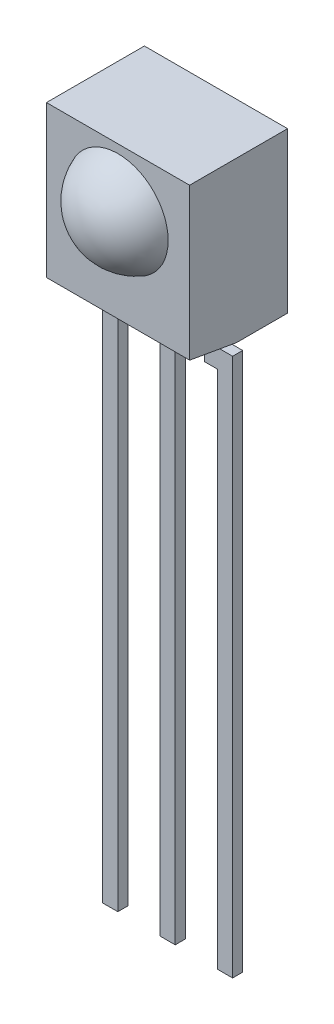
ISO-10303-21;
HEADER;
FILE_DESCRIPTION(('STEP AP214'),'2;1');
FILE_NAME('part.step','',(''),(''),'','','');
FILE_SCHEMA(('AUTOMOTIVE_DESIGN { 1 0 10303 214 1 1 1 1 }'));
ENDSEC;
DATA;
#1=APPLICATION_CONTEXT('core data for automotive mechanical design processes');
#2=APPLICATION_PROTOCOL_DEFINITION('international standard','automotive_design',2000,#1);
#3=PRODUCT_CONTEXT('',#1,'mechanical');
#4=PRODUCT('Part','Part','',(#3));
#5=PRODUCT_RELATED_PRODUCT_CATEGORY('part','',(#4));
#6=PRODUCT_DEFINITION_FORMATION('','',#4);
#7=PRODUCT_DEFINITION_CONTEXT('part definition',#1,'design');
#8=PRODUCT_DEFINITION('design','',#6,#7);
#9=PRODUCT_DEFINITION_SHAPE('','',#8);
#10=(LENGTH_UNIT() NAMED_UNIT(*) SI_UNIT(.MILLI.,.METRE.));
#11=(NAMED_UNIT(*) PLANE_ANGLE_UNIT() SI_UNIT($,.RADIAN.));
#12=(NAMED_UNIT(*) SI_UNIT($,.STERADIAN.) SOLID_ANGLE_UNIT());
#13=UNCERTAINTY_MEASURE_WITH_UNIT(LENGTH_MEASURE(1.E-05),#10,'distance_accuracy_value','');
#14=(GEOMETRIC_REPRESENTATION_CONTEXT(3) GLOBAL_UNCERTAINTY_ASSIGNED_CONTEXT((#13)) GLOBAL_UNIT_ASSIGNED_CONTEXT((#10,
#11,#12)) REPRESENTATION_CONTEXT('',''));
#15=CARTESIAN_POINT('',(0.,0.,0.));
#16=DIRECTION('',(0.,0.,1.));
#17=DIRECTION('',(1.,0.,0.));
#18=AXIS2_PLACEMENT_3D('',#15,#16,#17);
#19=CARTESIAN_POINT('',(-2.225,-4.91,1.635));
#20=DIRECTION('',(1.,0.,0.));
#21=DIRECTION('',(0.,1.,0.));
#22=AXIS2_PLACEMENT_3D('',#19,#20,#21);
#23=PLANE('',#22);
#24=DIRECTION('',(0.,0.,-1.));
#25=VECTOR('',#24,1.);
#26=CARTESIAN_POINT('',(-2.225,-4.11,1.635));
#27=LINE('',#26,#25);
#28=CARTESIAN_POINT('',(-2.225,-4.11,2.065));
#29=VERTEX_POINT('',#28);
#30=CARTESIAN_POINT('',(-2.225,-4.11,1.635));
#31=VERTEX_POINT('',#30);
#32=EDGE_CURVE('E284',#29,#31,#27,.T.);
#33=ORIENTED_EDGE('',*,*,#32,.F.);
#34=DIRECTION('',(0.,1.,0.));
#35=VECTOR('',#34,1.);
#36=CARTESIAN_POINT('',(-2.225,-4.91,2.065));
#37=LINE('',#36,#35);
#38=CARTESIAN_POINT('',(-2.225,-3.41,2.065));
#39=VERTEX_POINT('',#38);
#40=EDGE_CURVE('E306',#29,#39,#37,.T.);
#41=ORIENTED_EDGE('',*,*,#40,.T.);
#42=DIRECTION('',(0.,0.,-1.));
#43=VECTOR('',#42,1.);
#44=CARTESIAN_POINT('',(-2.225,-3.41,1.635));
#45=LINE('',#44,#43);
#46=CARTESIAN_POINT('',(-2.225,-3.41,1.635));
#47=VERTEX_POINT('',#46);
#48=EDGE_CURVE('E322',#39,#47,#45,.T.);
#49=ORIENTED_EDGE('',*,*,#48,.T.);
#50=DIRECTION('',(0.,1.,0.));
#51=VECTOR('',#50,1.);
#52=CARTESIAN_POINT('',(-2.225,-4.91,1.635));
#53=LINE('',#52,#51);
#54=EDGE_CURVE('E320',#31,#47,#53,.T.);
#55=ORIENTED_EDGE('',*,*,#54,.F.);
#56=EDGE_LOOP('',(#33,#41,#49,#55));
#57=FACE_BOUND('',#56,.T.);
#58=ADVANCED_FACE('F38',(#57),#23,.F.);
#59=CARTESIAN_POINT('',(3.055,-3.41,4.18));
#60=DIRECTION('',(0.,1.,0.));
#61=DIRECTION('',(-1.,0.,0.));
#62=AXIS2_PLACEMENT_3D('',#59,#60,#61);
#63=PLANE('',#62);
#64=DIRECTION('',(0.,0.,-1.));
#65=VECTOR('',#64,1.);
#66=CARTESIAN_POINT('',(1.575,-3.41,1.635));
#67=LINE('',#66,#65);
#68=CARTESIAN_POINT('',(1.575,-3.41,2.065));
#69=VERTEX_POINT('',#68);
#70=CARTESIAN_POINT('',(1.575,-3.41,1.635));
#71=VERTEX_POINT('',#70);
#72=EDGE_CURVE('E349',#69,#71,#67,.T.);
#73=ORIENTED_EDGE('',*,*,#72,.F.);
#74=DIRECTION('',(-1.,0.,0.));
#75=VECTOR('',#74,1.);
#76=CARTESIAN_POINT('',(2.225,-3.41,2.065));
#77=LINE('',#76,#75);
#78=CARTESIAN_POINT('',(2.225,-3.41,2.065));
#79=VERTEX_POINT('',#78);
#80=EDGE_CURVE('E325',#79,#69,#77,.T.);
#81=ORIENTED_EDGE('',*,*,#80,.F.);
#82=DIRECTION('',(0.,0.,1.));
#83=VECTOR('',#82,1.);
#84=CARTESIAN_POINT('',(2.225,-3.41,1.635));
#85=LINE('',#84,#83);
#86=CARTESIAN_POINT('',(2.225,-3.41,1.635));
#87=VERTEX_POINT('',#86);
#88=EDGE_CURVE('E339',#87,#79,#85,.T.);
#89=ORIENTED_EDGE('',*,*,#88,.F.);
#90=DIRECTION('',(1.,0.,0.));
#91=VECTOR('',#90,1.);
#92=CARTESIAN_POINT('',(2.225,-3.41,1.635));
#93=LINE('',#92,#91);
#94=EDGE_CURVE('E344',#71,#87,#93,.T.);
#95=ORIENTED_EDGE('',*,*,#94,.F.);
#96=EDGE_LOOP('',(#73,#81,#89,#95));
#97=FACE_BOUND('',#96,.T.);
#98=DIRECTION('',(0.,0.,-1.));
#99=VECTOR('',#98,1.);
#100=CARTESIAN_POINT('',(3.055,-3.41,4.18));
#101=LINE('',#100,#99);
#102=CARTESIAN_POINT('',(3.055,-3.41,2.17999999999996));
#103=VERTEX_POINT('',#102);
#104=CARTESIAN_POINT('',(3.055,-3.41,0.));
#105=VERTEX_POINT('',#104);
#106=EDGE_CURVE('E399',#103,#105,#101,.T.);
#107=ORIENTED_EDGE('',*,*,#106,.F.);
#108=DIRECTION('',(-1.,0.,0.));
#109=VECTOR('',#108,1.);
#110=CARTESIAN_POINT('',(-3.055,-3.41,2.17999999999996));
#111=LINE('',#110,#109);
#112=CARTESIAN_POINT('',(-3.055,-3.41,2.17999999999996));
#113=VERTEX_POINT('',#112);
#114=EDGE_CURVE('E47',#103,#113,#111,.T.);
#115=ORIENTED_EDGE('',*,*,#114,.T.);
#116=DIRECTION('',(0.,0.,-1.));
#117=VECTOR('',#116,1.);
#118=CARTESIAN_POINT('',(-3.055,-3.41,4.18));
#119=LINE('',#118,#117);
#120=CARTESIAN_POINT('',(-3.055,-3.41,0.));
#121=VERTEX_POINT('',#120);
#122=EDGE_CURVE('E401',#113,#121,#119,.T.);
#123=ORIENTED_EDGE('',*,*,#122,.T.);
#124=DIRECTION('',(1.,0.,0.));
#125=VECTOR('',#124,1.);
#126=CARTESIAN_POINT('',(3.055,-3.41,0.));
#127=LINE('',#126,#125);
#128=EDGE_CURVE('E388',#121,#105,#127,.T.);
#129=ORIENTED_EDGE('',*,*,#128,.T.);
#130=EDGE_LOOP('',(#107,#115,#123,#129));
#131=FACE_BOUND('',#130,.T.);
#132=DIRECTION('',(0.,0.,-1.));
#133=VECTOR('',#132,1.);
#134=CARTESIAN_POINT('',(-0.324999999999999,-3.41,1.635));
#135=LINE('',#134,#133);
#136=CARTESIAN_POINT('',(-0.324999999999999,-3.41,2.065));
#137=VERTEX_POINT('',#136);
#138=CARTESIAN_POINT('',(-0.324999999999998,-3.41,1.635));
#139=VERTEX_POINT('',#138);
#140=EDGE_CURVE('E352',#137,#139,#135,.T.);
#141=ORIENTED_EDGE('',*,*,#140,.F.);
#142=DIRECTION('',(-1.,0.,0.));
#143=VECTOR('',#142,1.);
#144=CARTESIAN_POINT('',(0.325000000000001,-3.41,2.065));
#145=LINE('',#144,#143);
#146=CARTESIAN_POINT('',(0.325000000000002,-3.41,2.065));
#147=VERTEX_POINT('',#146);
#148=EDGE_CURVE('E361',#147,#137,#145,.T.);
#149=ORIENTED_EDGE('',*,*,#148,.F.);
#150=DIRECTION('',(0.,0.,1.));
#151=VECTOR('',#150,1.);
#152=CARTESIAN_POINT('',(0.325000000000001,-3.41,1.635));
#153=LINE('',#152,#151);
#154=CARTESIAN_POINT('',(0.325000000000001,-3.41,1.635));
#155=VERTEX_POINT('',#154);
#156=EDGE_CURVE('E358',#155,#147,#153,.T.);
#157=ORIENTED_EDGE('',*,*,#156,.F.);
#158=DIRECTION('',(1.,0.,0.));
#159=VECTOR('',#158,1.);
#160=CARTESIAN_POINT('',(0.325000000000001,-3.41,1.635));
#161=LINE('',#160,#159);
#162=EDGE_CURVE('E355',#139,#155,#161,.T.);
#163=ORIENTED_EDGE('',*,*,#162,.F.);
#164=EDGE_LOOP('',(#141,#149,#157,#163));
#165=FACE_BOUND('',#164,.T.);
#166=ORIENTED_EDGE('',*,*,#48,.F.);
#167=DIRECTION('',(-1.,0.,0.));
#168=VECTOR('',#167,1.);
#169=CARTESIAN_POINT('',(-1.575,-3.41,2.065));
#170=LINE('',#169,#168);
#171=CARTESIAN_POINT('',(-1.575,-3.41,2.065));
#172=VERTEX_POINT('',#171);
#173=EDGE_CURVE('E297',#172,#39,#170,.T.);
#174=ORIENTED_EDGE('',*,*,#173,.F.);
#175=DIRECTION('',(0.,0.,1.));
#176=VECTOR('',#175,1.);
#177=CARTESIAN_POINT('',(-1.575,-3.41,1.635));
#178=LINE('',#177,#176);
#179=CARTESIAN_POINT('',(-1.575,-3.41,1.635));
#180=VERTEX_POINT('',#179);
#181=EDGE_CURVE('E311',#180,#172,#178,.T.);
#182=ORIENTED_EDGE('',*,*,#181,.F.);
#183=DIRECTION('',(1.,0.,0.));
#184=VECTOR('',#183,1.);
#185=CARTESIAN_POINT('',(-1.575,-3.41,1.635));
#186=LINE('',#185,#184);
#187=EDGE_CURVE('E317',#47,#180,#186,.T.);
#188=ORIENTED_EDGE('',*,*,#187,.F.);
#189=EDGE_LOOP('',(#166,#174,#182,#188));
#190=FACE_BOUND('',#189,.T.);
#191=ADVANCED_FACE('F438',(#97,#131,#165,#190),#63,.F.);
#192=CARTESIAN_POINT('',(-3.055,-3.41,4.18));
#193=DIRECTION('',(1.,0.,0.));
#194=DIRECTION('',(0.,0.,-1.));
#195=AXIS2_PLACEMENT_3D('',#192,#193,#194);
#196=PLANE('',#195);
#197=ORIENTED_EDGE('',*,*,#122,.F.);
#198=DIRECTION('',(0.,0.173648177666927,0.984807753012209));
#199=VECTOR('',#198,1.);
#200=CARTESIAN_POINT('',(-3.055,-3.05734603858307,4.18));
#201=LINE('',#200,#199);
#202=CARTESIAN_POINT('',(-3.055,-3.05734603858307,4.18));
#203=VERTEX_POINT('',#202);
#204=EDGE_CURVE('E11',#113,#203,#201,.T.);
#205=ORIENTED_EDGE('',*,*,#204,.T.);
#206=DIRECTION('',(0.,-1.,0.));
#207=VECTOR('',#206,1.);
#208=CARTESIAN_POINT('',(-3.055,-3.41,4.18));
#209=LINE('',#208,#207);
#210=CARTESIAN_POINT('',(-3.055,3.41,4.18));
#211=VERTEX_POINT('',#210);
#212=EDGE_CURVE('E377',#211,#203,#209,.T.);
#213=ORIENTED_EDGE('',*,*,#212,.F.);
#214=DIRECTION('',(0.,0.,-1.));
#215=VECTOR('',#214,1.);
#216=CARTESIAN_POINT('',(-3.055,3.41,4.18));
#217=LINE('',#216,#215);
#218=CARTESIAN_POINT('',(-3.055,3.41,0.));
#219=VERTEX_POINT('',#218);
#220=EDGE_CURVE('E385',#211,#219,#217,.T.);
#221=ORIENTED_EDGE('',*,*,#220,.T.);
#222=DIRECTION('',(0.,-1.,0.));
#223=VECTOR('',#222,1.);
#224=CARTESIAN_POINT('',(-3.055,-3.41,0.));
#225=LINE('',#224,#223);
#226=EDGE_CURVE('E376',#219,#121,#225,.T.);
#227=ORIENTED_EDGE('',*,*,#226,.T.);
#228=EDGE_LOOP('',(#197,#205,#213,#221,#227));
#229=FACE_BOUND('',#228,.T.);
#230=ADVANCED_FACE('F425',(#229),#196,.F.);
#231=CARTESIAN_POINT('',(3.055,-3.41,4.18));
#232=DIRECTION('',(-1.,0.,0.));
#233=DIRECTION('',(0.,0.,1.));
#234=AXIS2_PLACEMENT_3D('',#231,#232,#233);
#235=PLANE('',#234);
#236=DIRECTION('',(0.,1.,0.));
#237=VECTOR('',#236,1.);
#238=CARTESIAN_POINT('',(3.055,-3.41,4.18));
#239=LINE('',#238,#237);
#240=CARTESIAN_POINT('',(3.055,-3.05734603858307,4.18));
#241=VERTEX_POINT('',#240);
#242=CARTESIAN_POINT('',(3.055,3.41,4.18));
#243=VERTEX_POINT('',#242);
#244=EDGE_CURVE('E380',#241,#243,#239,.T.);
#245=ORIENTED_EDGE('',*,*,#244,.F.);
#246=DIRECTION('',(0.,-0.173648177666927,-0.984807753012209));
#247=VECTOR('',#246,1.);
#248=CARTESIAN_POINT('',(3.055,-3.05734603858307,4.18));
#249=LINE('',#248,#247);
#250=EDGE_CURVE('E61',#241,#103,#249,.T.);
#251=ORIENTED_EDGE('',*,*,#250,.T.);
#252=ORIENTED_EDGE('',*,*,#106,.T.);
#253=DIRECTION('',(0.,1.,0.));
#254=VECTOR('',#253,1.);
#255=CARTESIAN_POINT('',(3.055,-3.41,0.));
#256=LINE('',#255,#254);
#257=CARTESIAN_POINT('',(3.055,3.41,0.));
#258=VERTEX_POINT('',#257);
#259=EDGE_CURVE('E391',#105,#258,#256,.T.);
#260=ORIENTED_EDGE('',*,*,#259,.T.);
#261=DIRECTION('',(0.,0.,-1.));
#262=VECTOR('',#261,1.);
#263=CARTESIAN_POINT('',(3.055,3.41,4.18));
#264=LINE('',#263,#262);
#265=EDGE_CURVE('E396',#243,#258,#264,.T.);
#266=ORIENTED_EDGE('',*,*,#265,.F.);
#267=EDGE_LOOP('',(#245,#251,#252,#260,#266));
#268=FACE_BOUND('',#267,.T.);
#269=ADVANCED_FACE('F416',(#268),#235,.F.);
#270=CARTESIAN_POINT('',(3.055,3.41,4.18));
#271=DIRECTION('',(0.,-1.,0.));
#272=DIRECTION('',(1.,0.,0.));
#273=AXIS2_PLACEMENT_3D('',#270,#271,#272);
#274=PLANE('',#273);
#275=DIRECTION('',(-1.,0.,0.));
#276=VECTOR('',#275,1.);
#277=CARTESIAN_POINT('',(3.055,3.41,0.));
#278=LINE('',#277,#276);
#279=EDGE_CURVE('E381',#258,#219,#278,.T.);
#280=ORIENTED_EDGE('',*,*,#279,.T.);
#281=ORIENTED_EDGE('',*,*,#220,.F.);
#282=DIRECTION('',(-1.,0.,0.));
#283=VECTOR('',#282,1.);
#284=CARTESIAN_POINT('',(3.055,3.41,4.18));
#285=LINE('',#284,#283);
#286=EDGE_CURVE('E383',#243,#211,#285,.T.);
#287=ORIENTED_EDGE('',*,*,#286,.F.);
#288=ORIENTED_EDGE('',*,*,#265,.T.);
#289=EDGE_LOOP('',(#280,#281,#287,#288));
#290=FACE_BOUND('',#289,.T.);
#291=ADVANCED_FACE('F422',(#290),#274,.F.);
#292=CARTESIAN_POINT('',(0.,0.,4.18));
#293=DIRECTION('',(0.,0.,1.));
#294=DIRECTION('',(1.,0.,0.));
#295=AXIS2_PLACEMENT_3D('',#292,#293,#294);
#296=PLANE('',#295);
#297=CARTESIAN_POINT('',(0.,0.91,4.18));
#298=DIRECTION('',(0.,0.,1.));
#299=DIRECTION('',(1.,0.,0.));
#300=AXIS2_PLACEMENT_3D('',#297,#298,#299);
#301=CIRCLE('',#300,2.13892496362074);
#302=CARTESIAN_POINT('',(2.13892496362074,0.91,4.18));
#303=VERTEX_POINT('',#302);
#304=EDGE_CURVE('E403',#303,#303,#301,.T.);
#305=ORIENTED_EDGE('',*,*,#304,.F.);
#306=EDGE_LOOP('',(#305));
#307=FACE_BOUND('',#306,.T.);
#308=ORIENTED_EDGE('',*,*,#212,.T.);
#309=DIRECTION('',(1.,0.,0.));
#310=VECTOR('',#309,1.);
#311=CARTESIAN_POINT('',(3.055,-3.05734603858307,4.18));
#312=LINE('',#311,#310);
#313=EDGE_CURVE('E406',#203,#241,#312,.T.);
#314=ORIENTED_EDGE('',*,*,#313,.T.);
#315=ORIENTED_EDGE('',*,*,#244,.T.);
#316=ORIENTED_EDGE('',*,*,#286,.T.);
#317=EDGE_LOOP('',(#308,#314,#315,#316));
#318=FACE_BOUND('',#317,.T.);
#319=ADVANCED_FACE('F411',(#307,#318),#296,.T.);
#320=CARTESIAN_POINT('',(0.,0.,0.));
#321=DIRECTION('',(0.,0.,1.));
#322=DIRECTION('',(1.,0.,0.));
#323=AXIS2_PLACEMENT_3D('',#320,#321,#322);
#324=PLANE('',#323);
#325=ORIENTED_EDGE('',*,*,#226,.F.);
#326=ORIENTED_EDGE('',*,*,#279,.F.);
#327=ORIENTED_EDGE('',*,*,#259,.F.);
#328=ORIENTED_EDGE('',*,*,#128,.F.);
#329=EDGE_LOOP('',(#325,#326,#327,#328));
#330=FACE_BOUND('',#329,.T.);
#331=ADVANCED_FACE('F488',(#330),#324,.F.);
#332=CARTESIAN_POINT('',(0.,0.91,3.405));
#333=DIRECTION('',(0.,1.,0.));
#334=DIRECTION('',(0.,0.,-1.));
#335=AXIS2_PLACEMENT_3D('',#332,#333,#334);
#336=SPHERICAL_SURFACE('',#335,2.275);
#337=CARTESIAN_POINT('',(0.,0.91,3.405));
#338=DIRECTION('',(0.,0.,1.));
#339=DIRECTION('',(1.,0.,0.));
#340=AXIS2_PLACEMENT_3D('',#337,#338,#339);
#341=SPHERICAL_SURFACE('',#340,2.275);
#342=ORIENTED_EDGE('',*,*,#304,.T.);
#343=EDGE_LOOP('',(#342));
#344=FACE_BOUND('',#343,.T.);
#345=ADVANCED_FACE('F484',(#344),#341,.T.);
#346=CARTESIAN_POINT('',(-0.324999999999998,-4.91,1.635));
#347=DIRECTION('',(1.,0.,0.));
#348=DIRECTION('',(0.,1.,0.));
#349=AXIS2_PLACEMENT_3D('',#346,#347,#348);
#350=PLANE('',#349);
#351=ORIENTED_EDGE('',*,*,#140,.T.);
#352=DIRECTION('',(0.,1.,0.));
#353=VECTOR('',#352,1.);
#354=CARTESIAN_POINT('',(-0.324999999999998,-4.91,1.635));
#355=LINE('',#354,#353);
#356=CARTESIAN_POINT('',(-0.324999999999999,-27.09,1.635));
#357=VERTEX_POINT('',#356);
#358=EDGE_CURVE('E373',#357,#139,#355,.T.);
#359=ORIENTED_EDGE('',*,*,#358,.F.);
#360=DIRECTION('',(0.,0.,1.));
#361=VECTOR('',#360,1.);
#362=CARTESIAN_POINT('',(-0.324999999999999,-27.09,1.635));
#363=LINE('',#362,#361);
#364=CARTESIAN_POINT('',(-0.324999999999999,-27.09,2.065));
#365=VERTEX_POINT('',#364);
#366=EDGE_CURVE('E254',#357,#365,#363,.T.);
#367=ORIENTED_EDGE('',*,*,#366,.T.);
#368=DIRECTION('',(0.,1.,0.));
#369=VECTOR('',#368,1.);
#370=CARTESIAN_POINT('',(-0.324999999999998,-4.91,2.065));
#371=LINE('',#370,#369);
#372=EDGE_CURVE('E364',#365,#137,#371,.T.);
#373=ORIENTED_EDGE('',*,*,#372,.T.);
#374=EDGE_LOOP('',(#351,#359,#367,#373));
#375=FACE_BOUND('',#374,.T.);
#376=ADVANCED_FACE('F480',(#375),#350,.F.);
#377=CARTESIAN_POINT('',(0.325000000000002,-4.91,1.635));
#378=DIRECTION('',(0.,0.,1.));
#379=DIRECTION('',(1.,0.,0.));
#380=AXIS2_PLACEMENT_3D('',#377,#378,#379);
#381=PLANE('',#380);
#382=ORIENTED_EDGE('',*,*,#162,.T.);
#383=DIRECTION('',(0.,1.,0.));
#384=VECTOR('',#383,1.);
#385=CARTESIAN_POINT('',(0.325000000000002,-4.91,1.635));
#386=LINE('',#385,#384);
#387=CARTESIAN_POINT('',(0.325000000000002,-27.09,1.635));
#388=VERTEX_POINT('',#387);
#389=EDGE_CURVE('E370',#388,#155,#386,.T.);
#390=ORIENTED_EDGE('',*,*,#389,.F.);
#391=DIRECTION('',(-1.,0.,0.));
#392=VECTOR('',#391,1.);
#393=CARTESIAN_POINT('',(-0.324999999999999,-27.09,1.635));
#394=LINE('',#393,#392);
#395=EDGE_CURVE('E251',#388,#357,#394,.T.);
#396=ORIENTED_EDGE('',*,*,#395,.T.);
#397=ORIENTED_EDGE('',*,*,#358,.T.);
#398=EDGE_LOOP('',(#382,#390,#396,#397));
#399=FACE_BOUND('',#398,.T.);
#400=ADVANCED_FACE('F476',(#399),#381,.F.);
#401=CARTESIAN_POINT('',(0.325000000000002,-4.91,1.635));
#402=DIRECTION('',(-1.,0.,0.));
#403=DIRECTION('',(0.,-1.,0.));
#404=AXIS2_PLACEMENT_3D('',#401,#402,#403);
#405=PLANE('',#404);
#406=ORIENTED_EDGE('',*,*,#156,.T.);
#407=DIRECTION('',(0.,1.,0.));
#408=VECTOR('',#407,1.);
#409=CARTESIAN_POINT('',(0.325000000000002,-4.91,2.065));
#410=LINE('',#409,#408);
#411=CARTESIAN_POINT('',(0.325000000000002,-27.09,2.065));
#412=VERTEX_POINT('',#411);
#413=EDGE_CURVE('E367',#412,#147,#410,.T.);
#414=ORIENTED_EDGE('',*,*,#413,.F.);
#415=DIRECTION('',(0.,0.,-1.));
#416=VECTOR('',#415,1.);
#417=CARTESIAN_POINT('',(0.325000000000002,-27.09,1.635));
#418=LINE('',#417,#416);
#419=EDGE_CURVE('E248',#412,#388,#418,.T.);
#420=ORIENTED_EDGE('',*,*,#419,.T.);
#421=ORIENTED_EDGE('',*,*,#389,.T.);
#422=EDGE_LOOP('',(#406,#414,#420,#421));
#423=FACE_BOUND('',#422,.T.);
#424=ADVANCED_FACE('F472',(#423),#405,.F.);
#425=CARTESIAN_POINT('',(0.325000000000002,-4.91,2.065));
#426=DIRECTION('',(0.,0.,-1.));
#427=DIRECTION('',(-1.,0.,0.));
#428=AXIS2_PLACEMENT_3D('',#425,#426,#427);
#429=PLANE('',#428);
#430=ORIENTED_EDGE('',*,*,#148,.T.);
#431=ORIENTED_EDGE('',*,*,#372,.F.);
#432=DIRECTION('',(1.,0.,0.));
#433=VECTOR('',#432,1.);
#434=CARTESIAN_POINT('',(-0.324999999999999,-27.09,2.065));
#435=LINE('',#434,#433);
#436=EDGE_CURVE('E245',#365,#412,#435,.T.);
#437=ORIENTED_EDGE('',*,*,#436,.T.);
#438=ORIENTED_EDGE('',*,*,#413,.T.);
#439=EDGE_LOOP('',(#430,#431,#437,#438));
#440=FACE_BOUND('',#439,.T.);
#441=ADVANCED_FACE('F468',(#440),#429,.F.);
#442=CARTESIAN_POINT('',(1.575,-4.91,1.635));
#443=DIRECTION('',(1.,0.,0.));
#444=DIRECTION('',(0.,1.,0.));
#445=AXIS2_PLACEMENT_3D('',#442,#443,#444);
#446=PLANE('',#445);
#447=ORIENTED_EDGE('',*,*,#72,.T.);
#448=DIRECTION('',(0.,1.,0.));
#449=VECTOR('',#448,1.);
#450=CARTESIAN_POINT('',(1.575,-4.91,1.635));
#451=LINE('',#450,#449);
#452=CARTESIAN_POINT('',(1.575,-4.91,1.635));
#453=VERTEX_POINT('',#452);
#454=EDGE_CURVE('E346',#453,#71,#451,.T.);
#455=ORIENTED_EDGE('',*,*,#454,.F.);
#456=DIRECTION('',(0.,0.,-1.));
#457=VECTOR('',#456,1.);
#458=CARTESIAN_POINT('',(1.575,-4.91,1.635));
#459=LINE('',#458,#457);
#460=CARTESIAN_POINT('',(1.575,-4.91,2.065));
#461=VERTEX_POINT('',#460);
#462=EDGE_CURVE('E328',#461,#453,#459,.T.);
#463=ORIENTED_EDGE('',*,*,#462,.F.);
#464=DIRECTION('',(0.,1.,0.));
#465=VECTOR('',#464,1.);
#466=CARTESIAN_POINT('',(1.575,-4.91,2.065));
#467=LINE('',#466,#465);
#468=EDGE_CURVE('E334',#461,#69,#467,.T.);
#469=ORIENTED_EDGE('',*,*,#468,.T.);
#470=EDGE_LOOP('',(#447,#455,#463,#469));
#471=FACE_BOUND('',#470,.T.);
#472=ADVANCED_FACE('F465',(#471),#446,.F.);
#473=CARTESIAN_POINT('',(2.225,-4.91,1.635));
#474=DIRECTION('',(0.,0.,1.));
#475=DIRECTION('',(1.,0.,0.));
#476=AXIS2_PLACEMENT_3D('',#473,#474,#475);
#477=PLANE('',#476);
#478=ORIENTED_EDGE('',*,*,#94,.T.);
#479=DIRECTION('',(0.,1.,0.));
#480=VECTOR('',#479,1.);
#481=CARTESIAN_POINT('',(2.225,-4.91,1.635));
#482=LINE('',#481,#480);
#483=CARTESIAN_POINT('',(2.225,-4.11,1.635));
#484=VERTEX_POINT('',#483);
#485=EDGE_CURVE('E342',#484,#87,#482,.T.);
#486=ORIENTED_EDGE('',*,*,#485,.F.);
#487=DIRECTION('',(-1.,0.,0.));
#488=VECTOR('',#487,1.);
#489=CARTESIAN_POINT('',(2.775,-4.11,1.635));
#490=LINE('',#489,#488);
#491=CARTESIAN_POINT('',(2.775,-4.11,1.635));
#492=VERTEX_POINT('',#491);
#493=EDGE_CURVE('E282',#492,#484,#490,.T.);
#494=ORIENTED_EDGE('',*,*,#493,.F.);
#495=DIRECTION('',(0.,-1.,0.));
#496=VECTOR('',#495,1.);
#497=CARTESIAN_POINT('',(2.775,-4.91,1.635));
#498=LINE('',#497,#496);
#499=CARTESIAN_POINT('',(2.775,-27.09,1.635));
#500=VERTEX_POINT('',#499);
#501=EDGE_CURVE('E229',#492,#500,#498,.T.);
#502=ORIENTED_EDGE('',*,*,#501,.T.);
#503=DIRECTION('',(-1.,0.,0.));
#504=VECTOR('',#503,1.);
#505=CARTESIAN_POINT('',(2.775,-27.09,1.635));
#506=LINE('',#505,#504);
#507=CARTESIAN_POINT('',(2.125,-27.09,1.635));
#508=VERTEX_POINT('',#507);
#509=EDGE_CURVE('E221',#500,#508,#506,.T.);
#510=ORIENTED_EDGE('',*,*,#509,.T.);
#511=DIRECTION('',(0.,1.,0.));
#512=VECTOR('',#511,1.);
#513=CARTESIAN_POINT('',(2.125,-9.91,1.635));
#514=LINE('',#513,#512);
#515=CARTESIAN_POINT('',(2.125,-4.91,1.635));
#516=VERTEX_POINT('',#515);
#517=EDGE_CURVE('E205',#508,#516,#514,.T.);
#518=ORIENTED_EDGE('',*,*,#517,.T.);
#519=DIRECTION('',(1.,0.,0.));
#520=VECTOR('',#519,1.);
#521=CARTESIAN_POINT('',(2.225,-4.91,1.635));
#522=LINE('',#521,#520);
#523=EDGE_CURVE('E330',#453,#516,#522,.T.);
#524=ORIENTED_EDGE('',*,*,#523,.F.);
#525=ORIENTED_EDGE('',*,*,#454,.T.);
#526=EDGE_LOOP('',(#478,#486,#494,#502,#510,#518,#524,#525));
#527=FACE_BOUND('',#526,.T.);
#528=ADVANCED_FACE('F227',(#527),#477,.F.);
#529=CARTESIAN_POINT('',(2.225,-4.91,1.635));
#530=DIRECTION('',(-1.,0.,0.));
#531=DIRECTION('',(0.,-1.,0.));
#532=AXIS2_PLACEMENT_3D('',#529,#530,#531);
#533=PLANE('',#532);
#534=DIRECTION('',(0.,1.,0.));
#535=VECTOR('',#534,1.);
#536=CARTESIAN_POINT('',(2.225,-4.91,2.065));
#537=LINE('',#536,#535);
#538=CARTESIAN_POINT('',(2.225,-4.11,2.065));
#539=VERTEX_POINT('',#538);
#540=EDGE_CURVE('E337',#539,#79,#537,.T.);
#541=ORIENTED_EDGE('',*,*,#540,.F.);
#542=DIRECTION('',(0.,0.,-1.));
#543=VECTOR('',#542,1.);
#544=CARTESIAN_POINT('',(2.225,-4.11,1.635));
#545=LINE('',#544,#543);
#546=EDGE_CURVE('E270',#539,#484,#545,.T.);
#547=ORIENTED_EDGE('',*,*,#546,.T.);
#548=ORIENTED_EDGE('',*,*,#485,.T.);
#549=ORIENTED_EDGE('',*,*,#88,.T.);
#550=EDGE_LOOP('',(#541,#547,#548,#549));
#551=FACE_BOUND('',#550,.T.);
#552=ADVANCED_FACE('F458',(#551),#533,.F.);
#553=CARTESIAN_POINT('',(2.225,-4.91,2.065));
#554=DIRECTION('',(0.,0.,-1.));
#555=DIRECTION('',(-1.,0.,0.));
#556=AXIS2_PLACEMENT_3D('',#553,#554,#555);
#557=PLANE('',#556);
#558=ORIENTED_EDGE('',*,*,#80,.T.);
#559=ORIENTED_EDGE('',*,*,#468,.F.);
#560=DIRECTION('',(-1.,0.,0.));
#561=VECTOR('',#560,1.);
#562=CARTESIAN_POINT('',(2.225,-4.91,2.065));
#563=LINE('',#562,#561);
#564=CARTESIAN_POINT('',(2.125,-4.91,2.065));
#565=VERTEX_POINT('',#564);
#566=EDGE_CURVE('E332',#565,#461,#563,.T.);
#567=ORIENTED_EDGE('',*,*,#566,.F.);
#568=DIRECTION('',(0.,1.,0.));
#569=VECTOR('',#568,1.);
#570=CARTESIAN_POINT('',(2.125,-9.91,2.065));
#571=LINE('',#570,#569);
#572=CARTESIAN_POINT('',(2.125,-27.09,2.065));
#573=VERTEX_POINT('',#572);
#574=EDGE_CURVE('E214',#573,#565,#571,.T.);
#575=ORIENTED_EDGE('',*,*,#574,.F.);
#576=DIRECTION('',(1.,0.,0.));
#577=VECTOR('',#576,1.);
#578=CARTESIAN_POINT('',(2.775,-27.09,2.065));
#579=LINE('',#578,#577);
#580=CARTESIAN_POINT('',(2.775,-27.09,2.065));
#581=VERTEX_POINT('',#580);
#582=EDGE_CURVE('E224',#573,#581,#579,.T.);
#583=ORIENTED_EDGE('',*,*,#582,.T.);
#584=DIRECTION('',(0.,1.,0.));
#585=VECTOR('',#584,1.);
#586=CARTESIAN_POINT('',(2.775,-4.91,2.065));
#587=LINE('',#586,#585);
#588=CARTESIAN_POINT('',(2.775,-4.11,2.065));
#589=VERTEX_POINT('',#588);
#590=EDGE_CURVE('E275',#581,#589,#587,.T.);
#591=ORIENTED_EDGE('',*,*,#590,.T.);
#592=DIRECTION('',(-1.,0.,0.));
#593=VECTOR('',#592,1.);
#594=CARTESIAN_POINT('',(2.775,-4.11,2.065));
#595=LINE('',#594,#593);
#596=EDGE_CURVE('E278',#589,#539,#595,.T.);
#597=ORIENTED_EDGE('',*,*,#596,.T.);
#598=ORIENTED_EDGE('',*,*,#540,.T.);
#599=EDGE_LOOP('',(#558,#559,#567,#575,#583,#591,#597,#598));
#600=FACE_BOUND('',#599,.T.);
#601=ADVANCED_FACE('F454',(#600),#557,.F.);
#602=CARTESIAN_POINT('',(1.9,-4.91,0.));
#603=DIRECTION('',(0.,-1.,0.));
#604=DIRECTION('',(0.,0.,-1.));
#605=AXIS2_PLACEMENT_3D('',#602,#603,#604);
#606=PLANE('',#605);
#607=DIRECTION('',(0.,0.,-1.));
#608=VECTOR('',#607,1.);
#609=CARTESIAN_POINT('',(2.125,-4.91,1.635));
#610=LINE('',#609,#608);
#611=EDGE_CURVE('E210',#565,#516,#610,.T.);
#612=ORIENTED_EDGE('',*,*,#611,.F.);
#613=ORIENTED_EDGE('',*,*,#566,.T.);
#614=ORIENTED_EDGE('',*,*,#462,.T.);
#615=ORIENTED_EDGE('',*,*,#523,.T.);
#616=EDGE_LOOP('',(#612,#613,#614,#615));
#617=FACE_BOUND('',#616,.T.);
#618=ADVANCED_FACE('F451',(#617),#606,.T.);
#619=CARTESIAN_POINT('',(-1.575,-4.91,1.635));
#620=DIRECTION('',(0.,0.,1.));
#621=DIRECTION('',(1.,0.,0.));
#622=AXIS2_PLACEMENT_3D('',#619,#620,#621);
#623=PLANE('',#622);
#624=ORIENTED_EDGE('',*,*,#187,.T.);
#625=DIRECTION('',(0.,1.,0.));
#626=VECTOR('',#625,1.);
#627=CARTESIAN_POINT('',(-1.575,-4.91,1.635));
#628=LINE('',#627,#626);
#629=CARTESIAN_POINT('',(-1.575,-4.91,1.635));
#630=VERTEX_POINT('',#629);
#631=EDGE_CURVE('E314',#630,#180,#628,.T.);
#632=ORIENTED_EDGE('',*,*,#631,.F.);
#633=DIRECTION('',(1.,0.,0.));
#634=VECTOR('',#633,1.);
#635=CARTESIAN_POINT('',(-1.575,-4.91,1.635));
#636=LINE('',#635,#634);
#637=CARTESIAN_POINT('',(-2.125,-4.91,1.635));
#638=VERTEX_POINT('',#637);
#639=EDGE_CURVE('E300',#638,#630,#636,.T.);
#640=ORIENTED_EDGE('',*,*,#639,.F.);
#641=DIRECTION('',(0.,1.,0.));
#642=VECTOR('',#641,1.);
#643=CARTESIAN_POINT('',(-2.125,-9.91,1.635));
#644=LINE('',#643,#642);
#645=CARTESIAN_POINT('',(-2.125,-27.09,1.635));
#646=VERTEX_POINT('',#645);
#647=EDGE_CURVE('E267',#646,#638,#644,.T.);
#648=ORIENTED_EDGE('',*,*,#647,.F.);
#649=DIRECTION('',(-1.,0.,0.));
#650=VECTOR('',#649,1.);
#651=CARTESIAN_POINT('',(-2.125,-27.09,1.635));
#652=LINE('',#651,#650);
#653=CARTESIAN_POINT('',(-2.775,-27.09,1.635));
#654=VERTEX_POINT('',#653);
#655=EDGE_CURVE('E239',#646,#654,#652,.T.);
#656=ORIENTED_EDGE('',*,*,#655,.T.);
#657=DIRECTION('',(0.,-1.,0.));
#658=VECTOR('',#657,1.);
#659=CARTESIAN_POINT('',(-2.775,-4.91,1.635));
#660=LINE('',#659,#658);
#661=CARTESIAN_POINT('',(-2.775,-4.11,1.635));
#662=VERTEX_POINT('',#661);
#663=EDGE_CURVE('E285',#662,#654,#660,.T.);
#664=ORIENTED_EDGE('',*,*,#663,.F.);
#665=DIRECTION('',(1.,0.,0.));
#666=VECTOR('',#665,1.);
#667=CARTESIAN_POINT('',(-2.775,-4.11,1.635));
#668=LINE('',#667,#666);
#669=EDGE_CURVE('E291',#662,#31,#668,.T.);
#670=ORIENTED_EDGE('',*,*,#669,.T.);
#671=ORIENTED_EDGE('',*,*,#54,.T.);
#672=EDGE_LOOP('',(#624,#632,#640,#648,#656,#664,#670,#671));
#673=FACE_BOUND('',#672,.T.);
#674=ADVANCED_FACE('F449',(#673),#623,.F.);
#675=CARTESIAN_POINT('',(-1.575,-4.91,1.635));
#676=DIRECTION('',(-1.,0.,0.));
#677=DIRECTION('',(0.,-1.,0.));
#678=AXIS2_PLACEMENT_3D('',#675,#676,#677);
#679=PLANE('',#678);
#680=ORIENTED_EDGE('',*,*,#181,.T.);
#681=DIRECTION('',(0.,1.,0.));
#682=VECTOR('',#681,1.);
#683=CARTESIAN_POINT('',(-1.575,-4.91,2.065));
#684=LINE('',#683,#682);
#685=CARTESIAN_POINT('',(-1.575,-4.91,2.065));
#686=VERTEX_POINT('',#685);
#687=EDGE_CURVE('E308',#686,#172,#684,.T.);
#688=ORIENTED_EDGE('',*,*,#687,.F.);
#689=DIRECTION('',(0.,0.,1.));
#690=VECTOR('',#689,1.);
#691=CARTESIAN_POINT('',(-1.575,-4.91,1.635));
#692=LINE('',#691,#690);
#693=EDGE_CURVE('E302',#630,#686,#692,.T.);
#694=ORIENTED_EDGE('',*,*,#693,.F.);
#695=ORIENTED_EDGE('',*,*,#631,.T.);
#696=EDGE_LOOP('',(#680,#688,#694,#695));
#697=FACE_BOUND('',#696,.T.);
#698=ADVANCED_FACE('F569',(#697),#679,.F.);
#699=CARTESIAN_POINT('',(-1.575,-4.91,2.065));
#700=DIRECTION('',(0.,0.,-1.));
#701=DIRECTION('',(-1.,0.,0.));
#702=AXIS2_PLACEMENT_3D('',#699,#700,#701);
#703=PLANE('',#702);
#704=ORIENTED_EDGE('',*,*,#173,.T.);
#705=ORIENTED_EDGE('',*,*,#40,.F.);
#706=DIRECTION('',(1.,0.,0.));
#707=VECTOR('',#706,1.);
#708=CARTESIAN_POINT('',(-2.775,-4.11,2.065));
#709=LINE('',#708,#707);
#710=CARTESIAN_POINT('',(-2.775,-4.11,2.065));
#711=VERTEX_POINT('',#710);
#712=EDGE_CURVE('E295',#711,#29,#709,.T.);
#713=ORIENTED_EDGE('',*,*,#712,.F.);
#714=DIRECTION('',(0.,1.,0.));
#715=VECTOR('',#714,1.);
#716=CARTESIAN_POINT('',(-2.775,-4.91,2.065));
#717=LINE('',#716,#715);
#718=CARTESIAN_POINT('',(-2.775,-27.09,2.065));
#719=VERTEX_POINT('',#718);
#720=EDGE_CURVE('E287',#719,#711,#717,.T.);
#721=ORIENTED_EDGE('',*,*,#720,.F.);
#722=DIRECTION('',(1.,0.,0.));
#723=VECTOR('',#722,1.);
#724=CARTESIAN_POINT('',(-2.125,-27.09,2.065));
#725=LINE('',#724,#723);
#726=CARTESIAN_POINT('',(-2.125,-27.09,2.065));
#727=VERTEX_POINT('',#726);
#728=EDGE_CURVE('E238',#719,#727,#725,.T.);
#729=ORIENTED_EDGE('',*,*,#728,.T.);
#730=DIRECTION('',(0.,1.,0.));
#731=VECTOR('',#730,1.);
#732=CARTESIAN_POINT('',(-2.125,-9.91,2.065));
#733=LINE('',#732,#731);
#734=CARTESIAN_POINT('',(-2.125,-4.91,2.065));
#735=VERTEX_POINT('',#734);
#736=EDGE_CURVE('E264',#727,#735,#733,.T.);
#737=ORIENTED_EDGE('',*,*,#736,.T.);
#738=DIRECTION('',(-1.,0.,0.));
#739=VECTOR('',#738,1.);
#740=CARTESIAN_POINT('',(-1.575,-4.91,2.065));
#741=LINE('',#740,#739);
#742=EDGE_CURVE('E304',#686,#735,#741,.T.);
#743=ORIENTED_EDGE('',*,*,#742,.F.);
#744=ORIENTED_EDGE('',*,*,#687,.T.);
#745=EDGE_LOOP('',(#704,#705,#713,#721,#729,#737,#743,#744));
#746=FACE_BOUND('',#745,.T.);
#747=ADVANCED_FACE('F577',(#746),#703,.F.);
#748=CARTESIAN_POINT('',(-1.9,-4.91,0.));
#749=DIRECTION('',(0.,-1.,0.));
#750=DIRECTION('',(0.,0.,-1.));
#751=AXIS2_PLACEMENT_3D('',#748,#749,#750);
#752=PLANE('',#751);
#753=DIRECTION('',(0.,0.,1.));
#754=VECTOR('',#753,1.);
#755=CARTESIAN_POINT('',(-2.125,-4.91,1.635));
#756=LINE('',#755,#754);
#757=EDGE_CURVE('E261',#638,#735,#756,.T.);
#758=ORIENTED_EDGE('',*,*,#757,.F.);
#759=ORIENTED_EDGE('',*,*,#639,.T.);
#760=ORIENTED_EDGE('',*,*,#693,.T.);
#761=ORIENTED_EDGE('',*,*,#742,.T.);
#762=EDGE_LOOP('',(#758,#759,#760,#761));
#763=FACE_BOUND('',#762,.T.);
#764=ADVANCED_FACE('F583',(#763),#752,.T.);
#765=CARTESIAN_POINT('',(-2.775,-4.11,1.635));
#766=DIRECTION('',(0.,-1.,0.));
#767=DIRECTION('',(1.,0.,0.));
#768=AXIS2_PLACEMENT_3D('',#765,#766,#767);
#769=PLANE('',#768);
#770=ORIENTED_EDGE('',*,*,#32,.T.);
#771=ORIENTED_EDGE('',*,*,#669,.F.);
#772=DIRECTION('',(0.,0.,-1.));
#773=VECTOR('',#772,1.);
#774=CARTESIAN_POINT('',(-2.775,-4.11,1.635));
#775=LINE('',#774,#773);
#776=EDGE_CURVE('E289',#711,#662,#775,.T.);
#777=ORIENTED_EDGE('',*,*,#776,.F.);
#778=ORIENTED_EDGE('',*,*,#712,.T.);
#779=EDGE_LOOP('',(#770,#771,#777,#778));
#780=FACE_BOUND('',#779,.T.);
#781=ADVANCED_FACE('F591',(#780),#769,.F.);
#782=CARTESIAN_POINT('',(-2.775,0.,0.));
#783=DIRECTION('',(1.,0.,0.));
#784=DIRECTION('',(0.,1.,0.));
#785=AXIS2_PLACEMENT_3D('',#782,#783,#784);
#786=PLANE('',#785);
#787=ORIENTED_EDGE('',*,*,#663,.T.);
#788=DIRECTION('',(0.,0.,1.));
#789=VECTOR('',#788,1.);
#790=CARTESIAN_POINT('',(-2.775,-27.09,1.635));
#791=LINE('',#790,#789);
#792=EDGE_CURVE('E235',#654,#719,#791,.T.);
#793=ORIENTED_EDGE('',*,*,#792,.T.);
#794=ORIENTED_EDGE('',*,*,#720,.T.);
#795=ORIENTED_EDGE('',*,*,#776,.T.);
#796=EDGE_LOOP('',(#787,#793,#794,#795));
#797=FACE_BOUND('',#796,.T.);
#798=ADVANCED_FACE('F599',(#797),#786,.F.);
#799=CARTESIAN_POINT('',(2.775,-4.11,1.635));
#800=DIRECTION('',(0.,1.,0.));
#801=DIRECTION('',(-1.,0.,0.));
#802=AXIS2_PLACEMENT_3D('',#799,#800,#801);
#803=PLANE('',#802);
#804=ORIENTED_EDGE('',*,*,#546,.F.);
#805=ORIENTED_EDGE('',*,*,#596,.F.);
#806=DIRECTION('',(0.,0.,-1.));
#807=VECTOR('',#806,1.);
#808=CARTESIAN_POINT('',(2.775,-4.11,1.635));
#809=LINE('',#808,#807);
#810=EDGE_CURVE('E272',#589,#492,#809,.T.);
#811=ORIENTED_EDGE('',*,*,#810,.T.);
#812=ORIENTED_EDGE('',*,*,#493,.T.);
#813=EDGE_LOOP('',(#804,#805,#811,#812));
#814=FACE_BOUND('',#813,.T.);
#815=ADVANCED_FACE('F608',(#814),#803,.T.);
#816=CARTESIAN_POINT('',(2.775,0.,0.));
#817=DIRECTION('',(-1.,0.,0.));
#818=DIRECTION('',(0.,1.,0.));
#819=AXIS2_PLACEMENT_3D('',#816,#817,#818);
#820=PLANE('',#819);
#821=ORIENTED_EDGE('',*,*,#501,.F.);
#822=ORIENTED_EDGE('',*,*,#810,.F.);
#823=ORIENTED_EDGE('',*,*,#590,.F.);
#824=DIRECTION('',(0.,0.,-1.));
#825=VECTOR('',#824,1.);
#826=CARTESIAN_POINT('',(2.775,-27.09,1.635));
#827=LINE('',#826,#825);
#828=EDGE_CURVE('E233',#581,#500,#827,.T.);
#829=ORIENTED_EDGE('',*,*,#828,.T.);
#830=EDGE_LOOP('',(#821,#822,#823,#829));
#831=FACE_BOUND('',#830,.T.);
#832=ADVANCED_FACE('F616',(#831),#820,.F.);
#833=CARTESIAN_POINT('',(-2.125,-9.91,1.635));
#834=DIRECTION('',(-1.,0.,0.));
#835=DIRECTION('',(0.,0.,1.));
#836=AXIS2_PLACEMENT_3D('',#833,#834,#835);
#837=PLANE('',#836);
#838=ORIENTED_EDGE('',*,*,#757,.T.);
#839=ORIENTED_EDGE('',*,*,#736,.F.);
#840=DIRECTION('',(0.,0.,-1.));
#841=VECTOR('',#840,1.);
#842=CARTESIAN_POINT('',(-2.125,-27.09,1.635));
#843=LINE('',#842,#841);
#844=EDGE_CURVE('E242',#727,#646,#843,.T.);
#845=ORIENTED_EDGE('',*,*,#844,.T.);
#846=ORIENTED_EDGE('',*,*,#647,.T.);
#847=EDGE_LOOP('',(#838,#839,#845,#846));
#848=FACE_BOUND('',#847,.T.);
#849=ADVANCED_FACE('F435',(#848),#837,.F.);
#850=CARTESIAN_POINT('',(2.125,-9.91,1.635));
#851=DIRECTION('',(1.,0.,0.));
#852=DIRECTION('',(0.,0.,-1.));
#853=AXIS2_PLACEMENT_3D('',#850,#851,#852);
#854=PLANE('',#853);
#855=ORIENTED_EDGE('',*,*,#611,.T.);
#856=ORIENTED_EDGE('',*,*,#517,.F.);
#857=DIRECTION('',(0.,0.,1.));
#858=VECTOR('',#857,1.);
#859=CARTESIAN_POINT('',(2.125,-27.09,1.635));
#860=LINE('',#859,#858);
#861=EDGE_CURVE('E209',#508,#573,#860,.T.);
#862=ORIENTED_EDGE('',*,*,#861,.T.);
#863=ORIENTED_EDGE('',*,*,#574,.T.);
#864=EDGE_LOOP('',(#855,#856,#862,#863));
#865=FACE_BOUND('',#864,.T.);
#866=ADVANCED_FACE('F207',(#865),#854,.F.);
#867=CARTESIAN_POINT('',(0.,-3.05734603858307,4.18));
#868=DIRECTION('',(0.,-0.984807753012209,0.173648177666927));
#869=DIRECTION('',(-1.,0.,0.));
#870=AXIS2_PLACEMENT_3D('',#867,#868,#869);
#871=PLANE('',#870);
#872=ORIENTED_EDGE('',*,*,#204,.F.);
#873=ORIENTED_EDGE('',*,*,#114,.F.);
#874=ORIENTED_EDGE('',*,*,#250,.F.);
#875=ORIENTED_EDGE('',*,*,#313,.F.);
#876=EDGE_LOOP('',(#872,#873,#874,#875));
#877=FACE_BOUND('',#876,.T.);
#878=ADVANCED_FACE('F41',(#877),#871,.T.);
#879=CARTESIAN_POINT('',(0.,-27.09,0.));
#880=DIRECTION('',(0.,1.,0.));
#881=DIRECTION('',(-1.,0.,0.));
#882=AXIS2_PLACEMENT_3D('',#879,#880,#881);
#883=PLANE('',#882);
#884=ORIENTED_EDGE('',*,*,#395,.F.);
#885=ORIENTED_EDGE('',*,*,#419,.F.);
#886=ORIENTED_EDGE('',*,*,#436,.F.);
#887=ORIENTED_EDGE('',*,*,#366,.F.);
#888=EDGE_LOOP('',(#884,#885,#886,#887));
#889=FACE_BOUND('',#888,.T.);
#890=ADVANCED_FACE('F427',(#889),#883,.F.);
#891=CARTESIAN_POINT('',(0.,-27.09,0.));
#892=DIRECTION('',(0.,1.,0.));
#893=DIRECTION('',(-1.,0.,0.));
#894=AXIS2_PLACEMENT_3D('',#891,#892,#893);
#895=PLANE('',#894);
#896=ORIENTED_EDGE('',*,*,#728,.F.);
#897=ORIENTED_EDGE('',*,*,#792,.F.);
#898=ORIENTED_EDGE('',*,*,#655,.F.);
#899=ORIENTED_EDGE('',*,*,#844,.F.);
#900=EDGE_LOOP('',(#896,#897,#898,#899));
#901=FACE_BOUND('',#900,.T.);
#902=ADVANCED_FACE('F432',(#901),#895,.F.);
#903=CARTESIAN_POINT('',(0.,-27.09,0.));
#904=DIRECTION('',(0.,1.,0.));
#905=DIRECTION('',(-1.,0.,0.));
#906=AXIS2_PLACEMENT_3D('',#903,#904,#905);
#907=PLANE('',#906);
#908=ORIENTED_EDGE('',*,*,#582,.F.);
#909=ORIENTED_EDGE('',*,*,#861,.F.);
#910=ORIENTED_EDGE('',*,*,#509,.F.);
#911=ORIENTED_EDGE('',*,*,#828,.F.);
#912=EDGE_LOOP('',(#908,#909,#910,#911));
#913=FACE_BOUND('',#912,.T.);
#914=ADVANCED_FACE('F219',(#913),#907,.F.);
#915=CLOSED_SHELL('',(#58,#191,#230,#269,#291,#319,#331,#345,#376,#400,#424,#441,#472,#528,#552,
#601,#618,#674,#698,#747,#764,#781,#798,#815,#832,#849,#866,#878,#890,#902,#914));
#916=MANIFOLD_SOLID_BREP('B2',#915);
#917=ADVANCED_BREP_SHAPE_REPRESENTATION('',(#18,#916),#14);
#918=SHAPE_DEFINITION_REPRESENTATION(#9,#917);
ENDSEC;
END-ISO-10303-21;
